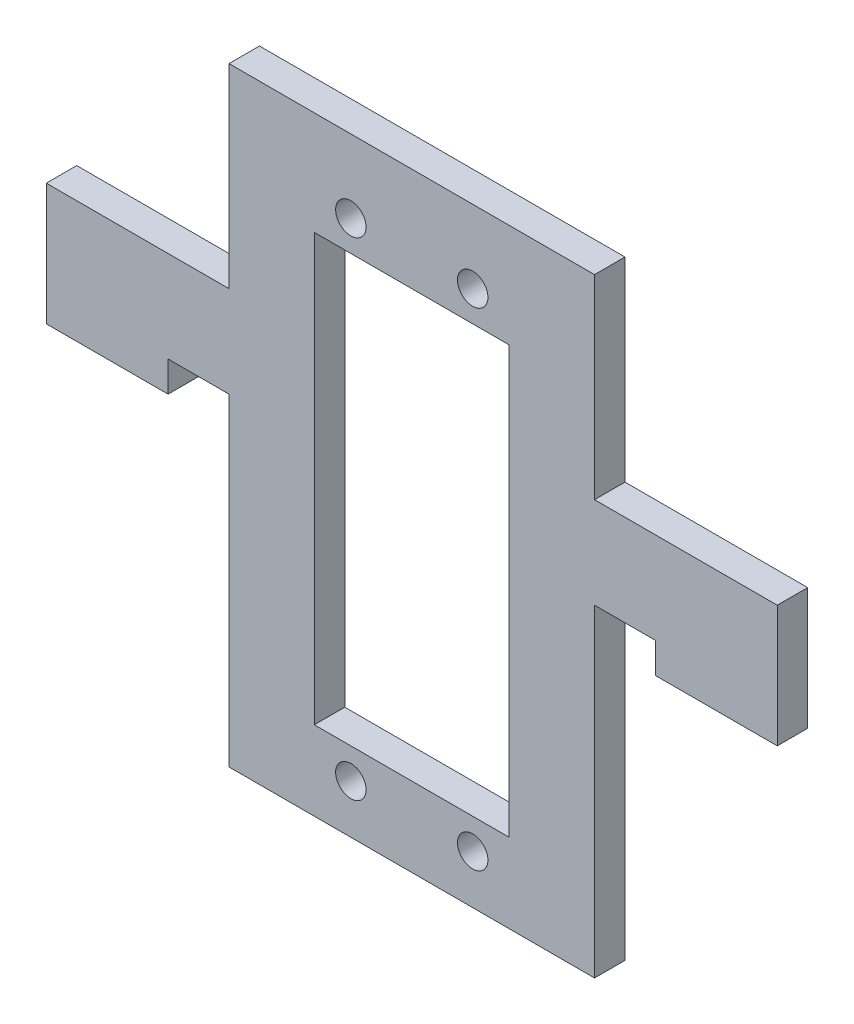
ISO-10303-21;
HEADER;
FILE_DESCRIPTION(('STEP AP214'),'2;1');
FILE_NAME('part.step','',(''),(''),'','','');
FILE_SCHEMA(('AUTOMOTIVE_DESIGN { 1 0 10303 214 1 1 1 1 }'));
ENDSEC;
DATA;
#1=APPLICATION_CONTEXT('core data for automotive mechanical design processes');
#2=APPLICATION_PROTOCOL_DEFINITION('international standard','automotive_design',2000,#1);
#3=PRODUCT_CONTEXT('',#1,'mechanical');
#4=PRODUCT('Part','Part','',(#3));
#5=PRODUCT_RELATED_PRODUCT_CATEGORY('part','',(#4));
#6=PRODUCT_DEFINITION_FORMATION('','',#4);
#7=PRODUCT_DEFINITION_CONTEXT('part definition',#1,'design');
#8=PRODUCT_DEFINITION('design','',#6,#7);
#9=PRODUCT_DEFINITION_SHAPE('','',#8);
#10=(LENGTH_UNIT() NAMED_UNIT(*) SI_UNIT(.MILLI.,.METRE.));
#11=(NAMED_UNIT(*) PLANE_ANGLE_UNIT() SI_UNIT($,.RADIAN.));
#12=(NAMED_UNIT(*) SI_UNIT($,.STERADIAN.) SOLID_ANGLE_UNIT());
#13=UNCERTAINTY_MEASURE_WITH_UNIT(LENGTH_MEASURE(1.E-05),#10,'distance_accuracy_value','');
#14=(GEOMETRIC_REPRESENTATION_CONTEXT(3) GLOBAL_UNCERTAINTY_ASSIGNED_CONTEXT((#13)) GLOBAL_UNIT_ASSIGNED_CONTEXT((#10,
#11,#12)) REPRESENTATION_CONTEXT('',''));
#15=CARTESIAN_POINT('',(0.,0.,0.));
#16=DIRECTION('',(0.,0.,1.));
#17=DIRECTION('',(1.,0.,0.));
#18=AXIS2_PLACEMENT_3D('',#15,#16,#17);
#19=CARTESIAN_POINT('',(0.,0.,3.175));
#20=DIRECTION('',(0.,0.,1.));
#21=DIRECTION('',(1.,0.,0.));
#22=AXIS2_PLACEMENT_3D('',#19,#20,#21);
#23=PLANE('',#22);
#24=CARTESIAN_POINT('',(16.51,-3.175,3.175));
#25=DIRECTION('',(0.,0.,1.));
#26=DIRECTION('',(-1.,0.,0.));
#27=AXIS2_PLACEMENT_3D('',#24,#25,#26);
#28=CIRCLE('',#27,1.5875);
#29=CARTESIAN_POINT('',(14.9225,-3.175,3.175));
#30=VERTEX_POINT('',#29);
#31=EDGE_CURVE('E629',#30,#30,#28,.T.);
#32=ORIENTED_EDGE('',*,*,#31,.F.);
#33=EDGE_LOOP('',(#32));
#34=FACE_BOUND('',#33,.T.);
#35=CARTESIAN_POINT('',(3.80999999999999,47.625,3.175));
#36=DIRECTION('',(0.,0.,1.));
#37=DIRECTION('',(1.,0.,0.));
#38=AXIS2_PLACEMENT_3D('',#35,#36,#37);
#39=CIRCLE('',#38,1.5875);
#40=CARTESIAN_POINT('',(5.39749999999999,47.625,3.175));
#41=VERTEX_POINT('',#40);
#42=EDGE_CURVE('E199',#41,#41,#39,.T.);
#43=ORIENTED_EDGE('',*,*,#42,.F.);
#44=EDGE_LOOP('',(#43));
#45=FACE_BOUND('',#44,.T.);
#46=DIRECTION('',(0.,-1.,0.));
#47=VECTOR('',#46,1.);
#48=CARTESIAN_POINT('',(-8.89000000000002,-8.25500000000001,3.175));
#49=LINE('',#48,#47);
#50=CARTESIAN_POINT('',(-8.89000000000001,25.4,3.175));
#51=VERTEX_POINT('',#50);
#52=CARTESIAN_POINT('',(-8.89000000000002,-8.25500000000001,3.175));
#53=VERTEX_POINT('',#52);
#54=EDGE_CURVE('E209',#51,#53,#49,.T.);
#55=ORIENTED_EDGE('',*,*,#54,.T.);
#56=DIRECTION('',(1.,0.,0.));
#57=VECTOR('',#56,1.);
#58=CARTESIAN_POINT('',(29.21,-8.25500000000001,3.175));
#59=LINE('',#58,#57);
#60=CARTESIAN_POINT('',(29.21,-8.25500000000001,3.175));
#61=VERTEX_POINT('',#60);
#62=EDGE_CURVE('E212',#53,#61,#59,.T.);
#63=ORIENTED_EDGE('',*,*,#62,.T.);
#64=DIRECTION('',(0.,1.,0.));
#65=VECTOR('',#64,1.);
#66=CARTESIAN_POINT('',(29.21,25.4,3.175));
#67=LINE('',#66,#65);
#68=CARTESIAN_POINT('',(29.21,25.4,3.175));
#69=VERTEX_POINT('',#68);
#70=EDGE_CURVE('E215',#61,#69,#67,.T.);
#71=ORIENTED_EDGE('',*,*,#70,.T.);
#72=DIRECTION('',(1.,0.,0.));
#73=VECTOR('',#72,1.);
#74=CARTESIAN_POINT('',(35.56,25.4,3.175));
#75=LINE('',#74,#73);
#76=CARTESIAN_POINT('',(35.56,25.4,3.175));
#77=VERTEX_POINT('',#76);
#78=EDGE_CURVE('E217',#69,#77,#75,.T.);
#79=ORIENTED_EDGE('',*,*,#78,.T.);
#80=DIRECTION('',(0.,-1.,0.));
#81=VECTOR('',#80,1.);
#82=CARTESIAN_POINT('',(35.56,22.225,3.175));
#83=LINE('',#82,#81);
#84=CARTESIAN_POINT('',(35.56,22.225,3.175));
#85=VERTEX_POINT('',#84);
#86=EDGE_CURVE('E219',#77,#85,#83,.T.);
#87=ORIENTED_EDGE('',*,*,#86,.T.);
#88=DIRECTION('',(1.,0.,0.));
#89=VECTOR('',#88,1.);
#90=CARTESIAN_POINT('',(48.26,22.225,3.175));
#91=LINE('',#90,#89);
#92=CARTESIAN_POINT('',(48.26,22.225,3.175));
#93=VERTEX_POINT('',#92);
#94=EDGE_CURVE('E221',#85,#93,#91,.T.);
#95=ORIENTED_EDGE('',*,*,#94,.T.);
#96=DIRECTION('',(0.,1.,0.));
#97=VECTOR('',#96,1.);
#98=CARTESIAN_POINT('',(48.26,34.925,3.175));
#99=LINE('',#98,#97);
#100=CARTESIAN_POINT('',(48.26,34.925,3.175));
#101=VERTEX_POINT('',#100);
#102=EDGE_CURVE('E223',#93,#101,#99,.T.);
#103=ORIENTED_EDGE('',*,*,#102,.T.);
#104=DIRECTION('',(-1.,0.,0.));
#105=VECTOR('',#104,1.);
#106=CARTESIAN_POINT('',(29.21,34.925,3.175));
#107=LINE('',#106,#105);
#108=CARTESIAN_POINT('',(29.21,34.925,3.175));
#109=VERTEX_POINT('',#108);
#110=EDGE_CURVE('E225',#101,#109,#107,.T.);
#111=ORIENTED_EDGE('',*,*,#110,.T.);
#112=DIRECTION('',(0.,1.,0.));
#113=VECTOR('',#112,1.);
#114=CARTESIAN_POINT('',(29.21,55.245,3.175));
#115=LINE('',#114,#113);
#116=CARTESIAN_POINT('',(29.21,55.245,3.175));
#117=VERTEX_POINT('',#116);
#118=EDGE_CURVE('E227',#109,#117,#115,.T.);
#119=ORIENTED_EDGE('',*,*,#118,.T.);
#120=DIRECTION('',(-1.,0.,0.));
#121=VECTOR('',#120,1.);
#122=CARTESIAN_POINT('',(-8.89000000000001,55.245,3.175));
#123=LINE('',#122,#121);
#124=CARTESIAN_POINT('',(-8.89000000000001,55.245,3.175));
#125=VERTEX_POINT('',#124);
#126=EDGE_CURVE('E229',#117,#125,#123,.T.);
#127=ORIENTED_EDGE('',*,*,#126,.T.);
#128=DIRECTION('',(0.,-1.,0.));
#129=VECTOR('',#128,1.);
#130=CARTESIAN_POINT('',(-8.89000000000001,34.925,3.175));
#131=LINE('',#130,#129);
#132=CARTESIAN_POINT('',(-8.89000000000001,34.925,3.175));
#133=VERTEX_POINT('',#132);
#134=EDGE_CURVE('E231',#125,#133,#131,.T.);
#135=ORIENTED_EDGE('',*,*,#134,.T.);
#136=DIRECTION('',(-1.,0.,0.));
#137=VECTOR('',#136,1.);
#138=CARTESIAN_POINT('',(-27.94,34.925,3.175));
#139=LINE('',#138,#137);
#140=CARTESIAN_POINT('',(-27.94,34.925,3.175));
#141=VERTEX_POINT('',#140);
#142=EDGE_CURVE('E233',#133,#141,#139,.T.);
#143=ORIENTED_EDGE('',*,*,#142,.T.);
#144=DIRECTION('',(0.,-1.,0.));
#145=VECTOR('',#144,1.);
#146=CARTESIAN_POINT('',(-27.94,22.225,3.175));
#147=LINE('',#146,#145);
#148=CARTESIAN_POINT('',(-27.94,22.225,3.175));
#149=VERTEX_POINT('',#148);
#150=EDGE_CURVE('E235',#141,#149,#147,.T.);
#151=ORIENTED_EDGE('',*,*,#150,.T.);
#152=DIRECTION('',(1.,0.,0.));
#153=VECTOR('',#152,1.);
#154=CARTESIAN_POINT('',(-15.24,22.225,3.175));
#155=LINE('',#154,#153);
#156=CARTESIAN_POINT('',(-15.24,22.225,3.175));
#157=VERTEX_POINT('',#156);
#158=EDGE_CURVE('E237',#149,#157,#155,.T.);
#159=ORIENTED_EDGE('',*,*,#158,.T.);
#160=DIRECTION('',(0.,1.,0.));
#161=VECTOR('',#160,1.);
#162=CARTESIAN_POINT('',(-15.24,25.4,3.175));
#163=LINE('',#162,#161);
#164=CARTESIAN_POINT('',(-15.24,25.4,3.175));
#165=VERTEX_POINT('',#164);
#166=EDGE_CURVE('E239',#157,#165,#163,.T.);
#167=ORIENTED_EDGE('',*,*,#166,.T.);
#168=DIRECTION('',(1.,0.,0.));
#169=VECTOR('',#168,1.);
#170=CARTESIAN_POINT('',(-8.89000000000001,25.4,3.175));
#171=LINE('',#170,#169);
#172=EDGE_CURVE('E241',#165,#51,#171,.T.);
#173=ORIENTED_EDGE('',*,*,#172,.T.);
#174=EDGE_LOOP('',(#55,#63,#71,#79,#87,#95,#103,#111,#119,#127,#135,#143,#151,#159,#167,#173));
#175=FACE_BOUND('',#174,.T.);
#176=DIRECTION('',(1.,0.,0.));
#177=VECTOR('',#176,1.);
#178=CARTESIAN_POINT('',(0.,0.,3.175));
#179=LINE('',#178,#177);
#180=CARTESIAN_POINT('',(0.,0.,3.175));
#181=VERTEX_POINT('',#180);
#182=CARTESIAN_POINT('',(20.32,0.,3.175));
#183=VERTEX_POINT('',#182);
#184=EDGE_CURVE('E178',#181,#183,#179,.T.);
#185=ORIENTED_EDGE('',*,*,#184,.F.);
#186=DIRECTION('',(0.,-1.,0.));
#187=VECTOR('',#186,1.);
#188=CARTESIAN_POINT('',(0.,0.,3.175));
#189=LINE('',#188,#187);
#190=CARTESIAN_POINT('',(0.,44.45,3.175));
#191=VERTEX_POINT('',#190);
#192=EDGE_CURVE('E170',#191,#181,#189,.T.);
#193=ORIENTED_EDGE('',*,*,#192,.F.);
#194=DIRECTION('',(-1.,0.,0.));
#195=VECTOR('',#194,1.);
#196=CARTESIAN_POINT('',(0.,44.45,3.175));
#197=LINE('',#196,#195);
#198=CARTESIAN_POINT('',(20.32,44.45,3.175));
#199=VERTEX_POINT('',#198);
#200=EDGE_CURVE('E193',#199,#191,#197,.T.);
#201=ORIENTED_EDGE('',*,*,#200,.F.);
#202=DIRECTION('',(0.,1.,0.));
#203=VECTOR('',#202,1.);
#204=CARTESIAN_POINT('',(20.32,0.,3.175));
#205=LINE('',#204,#203);
#206=EDGE_CURVE('E191',#183,#199,#205,.T.);
#207=ORIENTED_EDGE('',*,*,#206,.F.);
#208=EDGE_LOOP('',(#185,#193,#201,#207));
#209=FACE_BOUND('',#208,.T.);
#210=CARTESIAN_POINT('',(16.51,47.625,3.175));
#211=DIRECTION('',(0.,0.,1.));
#212=DIRECTION('',(1.,0.,0.));
#213=AXIS2_PLACEMENT_3D('',#210,#211,#212);
#214=CIRCLE('',#213,1.5875);
#215=CARTESIAN_POINT('',(18.0975,47.625,3.175));
#216=VERTEX_POINT('',#215);
#217=EDGE_CURVE('E635',#216,#216,#214,.T.);
#218=ORIENTED_EDGE('',*,*,#217,.F.);
#219=EDGE_LOOP('',(#218));
#220=FACE_BOUND('',#219,.T.);
#221=CARTESIAN_POINT('',(3.80999999999999,-3.175,3.175));
#222=DIRECTION('',(0.,0.,1.));
#223=DIRECTION('',(-1.,0.,0.));
#224=AXIS2_PLACEMENT_3D('',#221,#222,#223);
#225=CIRCLE('',#224,1.5875);
#226=CARTESIAN_POINT('',(2.22249999999999,-3.175,3.175));
#227=VERTEX_POINT('',#226);
#228=EDGE_CURVE('E620',#227,#227,#225,.T.);
#229=ORIENTED_EDGE('',*,*,#228,.F.);
#230=EDGE_LOOP('',(#229));
#231=FACE_BOUND('',#230,.T.);
#232=ADVANCED_FACE('F33',(#34,#45,#175,#209,#220,#231),#23,.T.);
#233=CARTESIAN_POINT('',(0.,0.,0.));
#234=DIRECTION('',(0.,0.,1.));
#235=DIRECTION('',(1.,0.,0.));
#236=AXIS2_PLACEMENT_3D('',#233,#234,#235);
#237=PLANE('',#236);
#238=DIRECTION('',(0.,-1.,0.));
#239=VECTOR('',#238,1.);
#240=CARTESIAN_POINT('',(-8.89000000000002,-8.25500000000001,0.));
#241=LINE('',#240,#239);
#242=CARTESIAN_POINT('',(-8.89000000000001,25.4,0.));
#243=VERTEX_POINT('',#242);
#244=CARTESIAN_POINT('',(-8.89000000000002,-8.25500000000001,0.));
#245=VERTEX_POINT('',#244);
#246=EDGE_CURVE('E186',#243,#245,#241,.T.);
#247=ORIENTED_EDGE('',*,*,#246,.F.);
#248=DIRECTION('',(1.,0.,0.));
#249=VECTOR('',#248,1.);
#250=CARTESIAN_POINT('',(-8.89000000000001,25.4,0.));
#251=LINE('',#250,#249);
#252=CARTESIAN_POINT('',(-15.24,25.4,0.));
#253=VERTEX_POINT('',#252);
#254=EDGE_CURVE('E213',#253,#243,#251,.T.);
#255=ORIENTED_EDGE('',*,*,#254,.F.);
#256=DIRECTION('',(0.,1.,0.));
#257=VECTOR('',#256,1.);
#258=CARTESIAN_POINT('',(-15.24,25.4,0.));
#259=LINE('',#258,#257);
#260=CARTESIAN_POINT('',(-15.24,22.225,0.));
#261=VERTEX_POINT('',#260);
#262=EDGE_CURVE('E272',#261,#253,#259,.T.);
#263=ORIENTED_EDGE('',*,*,#262,.F.);
#264=DIRECTION('',(1.,0.,0.));
#265=VECTOR('',#264,1.);
#266=CARTESIAN_POINT('',(-15.24,22.225,0.));
#267=LINE('',#266,#265);
#268=CARTESIAN_POINT('',(-27.94,22.225,0.));
#269=VERTEX_POINT('',#268);
#270=EDGE_CURVE('E270',#269,#261,#267,.T.);
#271=ORIENTED_EDGE('',*,*,#270,.F.);
#272=DIRECTION('',(0.,-1.,0.));
#273=VECTOR('',#272,1.);
#274=CARTESIAN_POINT('',(-27.94,22.225,0.));
#275=LINE('',#274,#273);
#276=CARTESIAN_POINT('',(-27.94,34.925,0.));
#277=VERTEX_POINT('',#276);
#278=EDGE_CURVE('E268',#277,#269,#275,.T.);
#279=ORIENTED_EDGE('',*,*,#278,.F.);
#280=DIRECTION('',(-1.,0.,0.));
#281=VECTOR('',#280,1.);
#282=CARTESIAN_POINT('',(-27.94,34.925,0.));
#283=LINE('',#282,#281);
#284=CARTESIAN_POINT('',(-8.89000000000001,34.925,0.));
#285=VERTEX_POINT('',#284);
#286=EDGE_CURVE('E266',#285,#277,#283,.T.);
#287=ORIENTED_EDGE('',*,*,#286,.F.);
#288=DIRECTION('',(0.,-1.,0.));
#289=VECTOR('',#288,1.);
#290=CARTESIAN_POINT('',(-8.89000000000001,34.925,0.));
#291=LINE('',#290,#289);
#292=CARTESIAN_POINT('',(-8.89000000000001,55.245,0.));
#293=VERTEX_POINT('',#292);
#294=EDGE_CURVE('E264',#293,#285,#291,.T.);
#295=ORIENTED_EDGE('',*,*,#294,.F.);
#296=DIRECTION('',(-1.,0.,0.));
#297=VECTOR('',#296,1.);
#298=CARTESIAN_POINT('',(-8.89000000000001,55.245,0.));
#299=LINE('',#298,#297);
#300=CARTESIAN_POINT('',(29.21,55.245,0.));
#301=VERTEX_POINT('',#300);
#302=EDGE_CURVE('E262',#301,#293,#299,.T.);
#303=ORIENTED_EDGE('',*,*,#302,.F.);
#304=DIRECTION('',(0.,1.,0.));
#305=VECTOR('',#304,1.);
#306=CARTESIAN_POINT('',(29.21,55.245,0.));
#307=LINE('',#306,#305);
#308=CARTESIAN_POINT('',(29.21,34.925,0.));
#309=VERTEX_POINT('',#308);
#310=EDGE_CURVE('E260',#309,#301,#307,.T.);
#311=ORIENTED_EDGE('',*,*,#310,.F.);
#312=DIRECTION('',(-1.,0.,0.));
#313=VECTOR('',#312,1.);
#314=CARTESIAN_POINT('',(29.21,34.925,0.));
#315=LINE('',#314,#313);
#316=CARTESIAN_POINT('',(48.26,34.925,0.));
#317=VERTEX_POINT('',#316);
#318=EDGE_CURVE('E258',#317,#309,#315,.T.);
#319=ORIENTED_EDGE('',*,*,#318,.F.);
#320=DIRECTION('',(0.,1.,0.));
#321=VECTOR('',#320,1.);
#322=CARTESIAN_POINT('',(48.26,34.925,0.));
#323=LINE('',#322,#321);
#324=CARTESIAN_POINT('',(48.26,22.225,0.));
#325=VERTEX_POINT('',#324);
#326=EDGE_CURVE('E256',#325,#317,#323,.T.);
#327=ORIENTED_EDGE('',*,*,#326,.F.);
#328=DIRECTION('',(1.,0.,0.));
#329=VECTOR('',#328,1.);
#330=CARTESIAN_POINT('',(48.26,22.225,0.));
#331=LINE('',#330,#329);
#332=CARTESIAN_POINT('',(35.56,22.225,0.));
#333=VERTEX_POINT('',#332);
#334=EDGE_CURVE('E254',#333,#325,#331,.T.);
#335=ORIENTED_EDGE('',*,*,#334,.F.);
#336=DIRECTION('',(0.,-1.,0.));
#337=VECTOR('',#336,1.);
#338=CARTESIAN_POINT('',(35.56,22.225,0.));
#339=LINE('',#338,#337);
#340=CARTESIAN_POINT('',(35.56,25.4,0.));
#341=VERTEX_POINT('',#340);
#342=EDGE_CURVE('E252',#341,#333,#339,.T.);
#343=ORIENTED_EDGE('',*,*,#342,.F.);
#344=DIRECTION('',(1.,0.,0.));
#345=VECTOR('',#344,1.);
#346=CARTESIAN_POINT('',(35.56,25.4,0.));
#347=LINE('',#346,#345);
#348=CARTESIAN_POINT('',(29.21,25.4,0.));
#349=VERTEX_POINT('',#348);
#350=EDGE_CURVE('E250',#349,#341,#347,.T.);
#351=ORIENTED_EDGE('',*,*,#350,.F.);
#352=DIRECTION('',(0.,1.,0.));
#353=VECTOR('',#352,1.);
#354=CARTESIAN_POINT('',(29.21,25.4,0.));
#355=LINE('',#354,#353);
#356=CARTESIAN_POINT('',(29.21,-8.25500000000001,0.));
#357=VERTEX_POINT('',#356);
#358=EDGE_CURVE('E248',#357,#349,#355,.T.);
#359=ORIENTED_EDGE('',*,*,#358,.F.);
#360=DIRECTION('',(1.,0.,0.));
#361=VECTOR('',#360,1.);
#362=CARTESIAN_POINT('',(29.21,-8.25500000000001,0.));
#363=LINE('',#362,#361);
#364=EDGE_CURVE('E246',#245,#357,#363,.T.);
#365=ORIENTED_EDGE('',*,*,#364,.F.);
#366=EDGE_LOOP('',(#247,#255,#263,#271,#279,#287,#295,#303,#311,#319,#327,#335,#343,#351,#359,#365));
#367=FACE_BOUND('',#366,.T.);
#368=DIRECTION('',(0.,-1.,0.));
#369=VECTOR('',#368,1.);
#370=CARTESIAN_POINT('',(0.,0.,0.));
#371=LINE('',#370,#369);
#372=CARTESIAN_POINT('',(0.,44.45,0.));
#373=VERTEX_POINT('',#372);
#374=CARTESIAN_POINT('',(0.,0.,0.));
#375=VERTEX_POINT('',#374);
#376=EDGE_CURVE('E56',#373,#375,#371,.T.);
#377=ORIENTED_EDGE('',*,*,#376,.T.);
#378=DIRECTION('',(1.,0.,0.));
#379=VECTOR('',#378,1.);
#380=CARTESIAN_POINT('',(0.,0.,0.));
#381=LINE('',#380,#379);
#382=CARTESIAN_POINT('',(20.32,0.,0.));
#383=VERTEX_POINT('',#382);
#384=EDGE_CURVE('E185',#375,#383,#381,.T.);
#385=ORIENTED_EDGE('',*,*,#384,.T.);
#386=DIRECTION('',(0.,1.,0.));
#387=VECTOR('',#386,1.);
#388=CARTESIAN_POINT('',(20.32,0.,0.));
#389=LINE('',#388,#387);
#390=CARTESIAN_POINT('',(20.32,44.45,0.));
#391=VERTEX_POINT('',#390);
#392=EDGE_CURVE('E201',#383,#391,#389,.T.);
#393=ORIENTED_EDGE('',*,*,#392,.T.);
#394=DIRECTION('',(-1.,0.,0.));
#395=VECTOR('',#394,1.);
#396=CARTESIAN_POINT('',(0.,44.45,0.));
#397=LINE('',#396,#395);
#398=EDGE_CURVE('E179',#391,#373,#397,.T.);
#399=ORIENTED_EDGE('',*,*,#398,.T.);
#400=EDGE_LOOP('',(#377,#385,#393,#399));
#401=FACE_BOUND('',#400,.T.);
#402=CARTESIAN_POINT('',(3.80999999999999,47.625,0.));
#403=DIRECTION('',(0.,0.,1.));
#404=DIRECTION('',(1.,0.,0.));
#405=AXIS2_PLACEMENT_3D('',#402,#403,#404);
#406=CIRCLE('',#405,1.5875);
#407=CARTESIAN_POINT('',(5.39749999999999,47.625,0.));
#408=VERTEX_POINT('',#407);
#409=EDGE_CURVE('E638',#408,#408,#406,.T.);
#410=ORIENTED_EDGE('',*,*,#409,.T.);
#411=EDGE_LOOP('',(#410));
#412=FACE_BOUND('',#411,.T.);
#413=CARTESIAN_POINT('',(16.51,47.625,0.));
#414=DIRECTION('',(0.,0.,1.));
#415=DIRECTION('',(1.,0.,0.));
#416=AXIS2_PLACEMENT_3D('',#413,#414,#415);
#417=CIRCLE('',#416,1.5875);
#418=CARTESIAN_POINT('',(18.0975,47.625,0.));
#419=VERTEX_POINT('',#418);
#420=EDGE_CURVE('E632',#419,#419,#417,.T.);
#421=ORIENTED_EDGE('',*,*,#420,.T.);
#422=EDGE_LOOP('',(#421));
#423=FACE_BOUND('',#422,.T.);
#424=CARTESIAN_POINT('',(16.51,-3.175,0.));
#425=DIRECTION('',(0.,0.,1.));
#426=DIRECTION('',(-1.,0.,0.));
#427=AXIS2_PLACEMENT_3D('',#424,#425,#426);
#428=CIRCLE('',#427,1.5875);
#429=CARTESIAN_POINT('',(14.9225,-3.175,0.));
#430=VERTEX_POINT('',#429);
#431=EDGE_CURVE('E626',#430,#430,#428,.T.);
#432=ORIENTED_EDGE('',*,*,#431,.T.);
#433=EDGE_LOOP('',(#432));
#434=FACE_BOUND('',#433,.T.);
#435=CARTESIAN_POINT('',(3.80999999999999,-3.175,0.));
#436=DIRECTION('',(0.,0.,1.));
#437=DIRECTION('',(-1.,0.,0.));
#438=AXIS2_PLACEMENT_3D('',#435,#436,#437);
#439=CIRCLE('',#438,1.5875);
#440=CARTESIAN_POINT('',(2.22249999999999,-3.175,0.));
#441=VERTEX_POINT('',#440);
#442=EDGE_CURVE('E623',#441,#441,#439,.T.);
#443=ORIENTED_EDGE('',*,*,#442,.T.);
#444=EDGE_LOOP('',(#443));
#445=FACE_BOUND('',#444,.T.);
#446=ADVANCED_FACE('F326',(#367,#401,#412,#423,#434,#445),#237,.F.);
#447=CARTESIAN_POINT('',(-8.89000000000002,-8.25500000000001,3.175));
#448=DIRECTION('',(1.,0.,0.));
#449=DIRECTION('',(0.,1.,0.));
#450=AXIS2_PLACEMENT_3D('',#447,#448,#449);
#451=PLANE('',#450);
#452=ORIENTED_EDGE('',*,*,#246,.T.);
#453=DIRECTION('',(0.,0.,-1.));
#454=VECTOR('',#453,1.);
#455=CARTESIAN_POINT('',(-8.89000000000002,-8.25500000000001,3.175));
#456=LINE('',#455,#454);
#457=EDGE_CURVE('E11',#53,#245,#456,.T.);
#458=ORIENTED_EDGE('',*,*,#457,.F.);
#459=ORIENTED_EDGE('',*,*,#54,.F.);
#460=DIRECTION('',(0.,0.,-1.));
#461=VECTOR('',#460,1.);
#462=CARTESIAN_POINT('',(-8.89000000000001,25.4,3.175));
#463=LINE('',#462,#461);
#464=EDGE_CURVE('E243',#51,#243,#463,.T.);
#465=ORIENTED_EDGE('',*,*,#464,.T.);
#466=EDGE_LOOP('',(#452,#458,#459,#465));
#467=FACE_BOUND('',#466,.T.);
#468=ADVANCED_FACE('F35',(#467),#451,.F.);
#469=CARTESIAN_POINT('',(29.21,-8.25500000000001,3.175));
#470=DIRECTION('',(0.,1.,0.));
#471=DIRECTION('',(0.,0.,1.));
#472=AXIS2_PLACEMENT_3D('',#469,#470,#471);
#473=PLANE('',#472);
#474=ORIENTED_EDGE('',*,*,#364,.T.);
#475=DIRECTION('',(0.,0.,-1.));
#476=VECTOR('',#475,1.);
#477=CARTESIAN_POINT('',(29.21,-8.25500000000001,3.175));
#478=LINE('',#477,#476);
#479=EDGE_CURVE('E41',#61,#357,#478,.T.);
#480=ORIENTED_EDGE('',*,*,#479,.F.);
#481=ORIENTED_EDGE('',*,*,#62,.F.);
#482=ORIENTED_EDGE('',*,*,#457,.T.);
#483=EDGE_LOOP('',(#474,#480,#481,#482));
#484=FACE_BOUND('',#483,.T.);
#485=ADVANCED_FACE('F343',(#484),#473,.F.);
#486=CARTESIAN_POINT('',(29.21,25.4,3.175));
#487=DIRECTION('',(-1.,0.,0.));
#488=DIRECTION('',(0.,-1.,0.));
#489=AXIS2_PLACEMENT_3D('',#486,#487,#488);
#490=PLANE('',#489);
#491=ORIENTED_EDGE('',*,*,#358,.T.);
#492=DIRECTION('',(0.,0.,-1.));
#493=VECTOR('',#492,1.);
#494=CARTESIAN_POINT('',(29.21,25.4,3.175));
#495=LINE('',#494,#493);
#496=EDGE_CURVE('E313',#69,#349,#495,.T.);
#497=ORIENTED_EDGE('',*,*,#496,.F.);
#498=ORIENTED_EDGE('',*,*,#70,.F.);
#499=ORIENTED_EDGE('',*,*,#479,.T.);
#500=EDGE_LOOP('',(#491,#497,#498,#499));
#501=FACE_BOUND('',#500,.T.);
#502=ADVANCED_FACE('F320',(#501),#490,.F.);
#503=CARTESIAN_POINT('',(35.56,25.4,3.175));
#504=DIRECTION('',(0.,1.,0.));
#505=DIRECTION('',(0.,0.,1.));
#506=AXIS2_PLACEMENT_3D('',#503,#504,#505);
#507=PLANE('',#506);
#508=ORIENTED_EDGE('',*,*,#350,.T.);
#509=DIRECTION('',(0.,0.,-1.));
#510=VECTOR('',#509,1.);
#511=CARTESIAN_POINT('',(35.56,25.4,3.175));
#512=LINE('',#511,#510);
#513=EDGE_CURVE('E310',#77,#341,#512,.T.);
#514=ORIENTED_EDGE('',*,*,#513,.F.);
#515=ORIENTED_EDGE('',*,*,#78,.F.);
#516=ORIENTED_EDGE('',*,*,#496,.T.);
#517=EDGE_LOOP('',(#508,#514,#515,#516));
#518=FACE_BOUND('',#517,.T.);
#519=ADVANCED_FACE('F332',(#518),#507,.F.);
#520=CARTESIAN_POINT('',(35.56,22.225,3.175));
#521=DIRECTION('',(1.,0.,0.));
#522=DIRECTION('',(0.,1.,0.));
#523=AXIS2_PLACEMENT_3D('',#520,#521,#522);
#524=PLANE('',#523);
#525=ORIENTED_EDGE('',*,*,#342,.T.);
#526=DIRECTION('',(0.,0.,-1.));
#527=VECTOR('',#526,1.);
#528=CARTESIAN_POINT('',(35.56,22.225,3.175));
#529=LINE('',#528,#527);
#530=EDGE_CURVE('E307',#85,#333,#529,.T.);
#531=ORIENTED_EDGE('',*,*,#530,.F.);
#532=ORIENTED_EDGE('',*,*,#86,.F.);
#533=ORIENTED_EDGE('',*,*,#513,.T.);
#534=EDGE_LOOP('',(#525,#531,#532,#533));
#535=FACE_BOUND('',#534,.T.);
#536=ADVANCED_FACE('F336',(#535),#524,.F.);
#537=CARTESIAN_POINT('',(48.26,22.225,3.175));
#538=DIRECTION('',(0.,1.,0.));
#539=DIRECTION('',(0.,0.,1.));
#540=AXIS2_PLACEMENT_3D('',#537,#538,#539);
#541=PLANE('',#540);
#542=ORIENTED_EDGE('',*,*,#334,.T.);
#543=DIRECTION('',(0.,0.,-1.));
#544=VECTOR('',#543,1.);
#545=CARTESIAN_POINT('',(48.26,22.225,3.175));
#546=LINE('',#545,#544);
#547=EDGE_CURVE('E304',#93,#325,#546,.T.);
#548=ORIENTED_EDGE('',*,*,#547,.F.);
#549=ORIENTED_EDGE('',*,*,#94,.F.);
#550=ORIENTED_EDGE('',*,*,#530,.T.);
#551=EDGE_LOOP('',(#542,#548,#549,#550));
#552=FACE_BOUND('',#551,.T.);
#553=ADVANCED_FACE('F396',(#552),#541,.F.);
#554=CARTESIAN_POINT('',(48.26,34.925,3.175));
#555=DIRECTION('',(-1.,0.,0.));
#556=DIRECTION('',(0.,0.,1.));
#557=AXIS2_PLACEMENT_3D('',#554,#555,#556);
#558=PLANE('',#557);
#559=ORIENTED_EDGE('',*,*,#326,.T.);
#560=DIRECTION('',(0.,0.,-1.));
#561=VECTOR('',#560,1.);
#562=CARTESIAN_POINT('',(48.26,34.925,3.175));
#563=LINE('',#562,#561);
#564=EDGE_CURVE('E301',#101,#317,#563,.T.);
#565=ORIENTED_EDGE('',*,*,#564,.F.);
#566=ORIENTED_EDGE('',*,*,#102,.F.);
#567=ORIENTED_EDGE('',*,*,#547,.T.);
#568=EDGE_LOOP('',(#559,#565,#566,#567));
#569=FACE_BOUND('',#568,.T.);
#570=ADVANCED_FACE('F393',(#569),#558,.F.);
#571=CARTESIAN_POINT('',(29.21,34.925,3.175));
#572=DIRECTION('',(0.,-1.,0.));
#573=DIRECTION('',(0.,0.,-1.));
#574=AXIS2_PLACEMENT_3D('',#571,#572,#573);
#575=PLANE('',#574);
#576=ORIENTED_EDGE('',*,*,#318,.T.);
#577=DIRECTION('',(0.,0.,-1.));
#578=VECTOR('',#577,1.);
#579=CARTESIAN_POINT('',(29.21,34.925,3.175));
#580=LINE('',#579,#578);
#581=EDGE_CURVE('E298',#109,#309,#580,.T.);
#582=ORIENTED_EDGE('',*,*,#581,.F.);
#583=ORIENTED_EDGE('',*,*,#110,.F.);
#584=ORIENTED_EDGE('',*,*,#564,.T.);
#585=EDGE_LOOP('',(#576,#582,#583,#584));
#586=FACE_BOUND('',#585,.T.);
#587=ADVANCED_FACE('F389',(#586),#575,.F.);
#588=CARTESIAN_POINT('',(29.21,55.245,3.175));
#589=DIRECTION('',(-1.,0.,0.));
#590=DIRECTION('',(0.,0.,1.));
#591=AXIS2_PLACEMENT_3D('',#588,#589,#590);
#592=PLANE('',#591);
#593=ORIENTED_EDGE('',*,*,#310,.T.);
#594=DIRECTION('',(0.,0.,-1.));
#595=VECTOR('',#594,1.);
#596=CARTESIAN_POINT('',(29.21,55.245,3.175));
#597=LINE('',#596,#595);
#598=EDGE_CURVE('E295',#117,#301,#597,.T.);
#599=ORIENTED_EDGE('',*,*,#598,.F.);
#600=ORIENTED_EDGE('',*,*,#118,.F.);
#601=ORIENTED_EDGE('',*,*,#581,.T.);
#602=EDGE_LOOP('',(#593,#599,#600,#601));
#603=FACE_BOUND('',#602,.T.);
#604=ADVANCED_FACE('F385',(#603),#592,.F.);
#605=CARTESIAN_POINT('',(-8.89000000000001,55.245,3.175));
#606=DIRECTION('',(0.,-1.,0.));
#607=DIRECTION('',(0.,0.,-1.));
#608=AXIS2_PLACEMENT_3D('',#605,#606,#607);
#609=PLANE('',#608);
#610=ORIENTED_EDGE('',*,*,#302,.T.);
#611=DIRECTION('',(0.,0.,-1.));
#612=VECTOR('',#611,1.);
#613=CARTESIAN_POINT('',(-8.89000000000001,55.245,3.175));
#614=LINE('',#613,#612);
#615=EDGE_CURVE('E292',#125,#293,#614,.T.);
#616=ORIENTED_EDGE('',*,*,#615,.F.);
#617=ORIENTED_EDGE('',*,*,#126,.F.);
#618=ORIENTED_EDGE('',*,*,#598,.T.);
#619=EDGE_LOOP('',(#610,#616,#617,#618));
#620=FACE_BOUND('',#619,.T.);
#621=ADVANCED_FACE('F380',(#620),#609,.F.);
#622=CARTESIAN_POINT('',(-8.89000000000001,34.925,3.175));
#623=DIRECTION('',(1.,0.,0.));
#624=DIRECTION('',(0.,0.,-1.));
#625=AXIS2_PLACEMENT_3D('',#622,#623,#624);
#626=PLANE('',#625);
#627=ORIENTED_EDGE('',*,*,#294,.T.);
#628=DIRECTION('',(0.,0.,-1.));
#629=VECTOR('',#628,1.);
#630=CARTESIAN_POINT('',(-8.89000000000001,34.925,3.175));
#631=LINE('',#630,#629);
#632=EDGE_CURVE('E289',#133,#285,#631,.T.);
#633=ORIENTED_EDGE('',*,*,#632,.F.);
#634=ORIENTED_EDGE('',*,*,#134,.F.);
#635=ORIENTED_EDGE('',*,*,#615,.T.);
#636=EDGE_LOOP('',(#627,#633,#634,#635));
#637=FACE_BOUND('',#636,.T.);
#638=ADVANCED_FACE('F374',(#637),#626,.F.);
#639=CARTESIAN_POINT('',(-27.94,34.925,3.175));
#640=DIRECTION('',(0.,-1.,0.));
#641=DIRECTION('',(0.,0.,-1.));
#642=AXIS2_PLACEMENT_3D('',#639,#640,#641);
#643=PLANE('',#642);
#644=ORIENTED_EDGE('',*,*,#286,.T.);
#645=DIRECTION('',(0.,0.,-1.));
#646=VECTOR('',#645,1.);
#647=CARTESIAN_POINT('',(-27.94,34.925,3.175));
#648=LINE('',#647,#646);
#649=EDGE_CURVE('E286',#141,#277,#648,.T.);
#650=ORIENTED_EDGE('',*,*,#649,.F.);
#651=ORIENTED_EDGE('',*,*,#142,.F.);
#652=ORIENTED_EDGE('',*,*,#632,.T.);
#653=EDGE_LOOP('',(#644,#650,#651,#652));
#654=FACE_BOUND('',#653,.T.);
#655=ADVANCED_FACE('F370',(#654),#643,.F.);
#656=CARTESIAN_POINT('',(-27.94,22.225,3.175));
#657=DIRECTION('',(1.,0.,0.));
#658=DIRECTION('',(0.,0.,-1.));
#659=AXIS2_PLACEMENT_3D('',#656,#657,#658);
#660=PLANE('',#659);
#661=ORIENTED_EDGE('',*,*,#278,.T.);
#662=DIRECTION('',(0.,0.,-1.));
#663=VECTOR('',#662,1.);
#664=CARTESIAN_POINT('',(-27.94,22.225,3.175));
#665=LINE('',#664,#663);
#666=EDGE_CURVE('E283',#149,#269,#665,.T.);
#667=ORIENTED_EDGE('',*,*,#666,.F.);
#668=ORIENTED_EDGE('',*,*,#150,.F.);
#669=ORIENTED_EDGE('',*,*,#649,.T.);
#670=EDGE_LOOP('',(#661,#667,#668,#669));
#671=FACE_BOUND('',#670,.T.);
#672=ADVANCED_FACE('F365',(#671),#660,.F.);
#673=CARTESIAN_POINT('',(-15.24,22.225,3.175));
#674=DIRECTION('',(0.,1.,0.));
#675=DIRECTION('',(-1.,0.,0.));
#676=AXIS2_PLACEMENT_3D('',#673,#674,#675);
#677=PLANE('',#676);
#678=ORIENTED_EDGE('',*,*,#270,.T.);
#679=DIRECTION('',(0.,0.,-1.));
#680=VECTOR('',#679,1.);
#681=CARTESIAN_POINT('',(-15.24,22.225,3.175));
#682=LINE('',#681,#680);
#683=EDGE_CURVE('E280',#157,#261,#682,.T.);
#684=ORIENTED_EDGE('',*,*,#683,.F.);
#685=ORIENTED_EDGE('',*,*,#158,.F.);
#686=ORIENTED_EDGE('',*,*,#666,.T.);
#687=EDGE_LOOP('',(#678,#684,#685,#686));
#688=FACE_BOUND('',#687,.T.);
#689=ADVANCED_FACE('F359',(#688),#677,.F.);
#690=CARTESIAN_POINT('',(-15.24,25.4,3.175));
#691=DIRECTION('',(-1.,0.,0.));
#692=DIRECTION('',(0.,-1.,0.));
#693=AXIS2_PLACEMENT_3D('',#690,#691,#692);
#694=PLANE('',#693);
#695=ORIENTED_EDGE('',*,*,#262,.T.);
#696=DIRECTION('',(0.,0.,-1.));
#697=VECTOR('',#696,1.);
#698=CARTESIAN_POINT('',(-15.24,25.4,3.175));
#699=LINE('',#698,#697);
#700=EDGE_CURVE('E277',#165,#253,#699,.T.);
#701=ORIENTED_EDGE('',*,*,#700,.F.);
#702=ORIENTED_EDGE('',*,*,#166,.F.);
#703=ORIENTED_EDGE('',*,*,#683,.T.);
#704=EDGE_LOOP('',(#695,#701,#702,#703));
#705=FACE_BOUND('',#704,.T.);
#706=ADVANCED_FACE('F355',(#705),#694,.F.);
#707=CARTESIAN_POINT('',(-8.89000000000001,25.4,3.175));
#708=DIRECTION('',(0.,1.,0.));
#709=DIRECTION('',(0.,0.,1.));
#710=AXIS2_PLACEMENT_3D('',#707,#708,#709);
#711=PLANE('',#710);
#712=ORIENTED_EDGE('',*,*,#254,.T.);
#713=ORIENTED_EDGE('',*,*,#464,.F.);
#714=ORIENTED_EDGE('',*,*,#172,.F.);
#715=ORIENTED_EDGE('',*,*,#700,.T.);
#716=EDGE_LOOP('',(#712,#713,#714,#715));
#717=FACE_BOUND('',#716,.T.);
#718=ADVANCED_FACE('F350',(#717),#711,.F.);
#719=CARTESIAN_POINT('',(0.,0.,3.175));
#720=DIRECTION('',(1.,0.,0.));
#721=DIRECTION('',(0.,1.,0.));
#722=AXIS2_PLACEMENT_3D('',#719,#720,#721);
#723=PLANE('',#722);
#724=ORIENTED_EDGE('',*,*,#376,.F.);
#725=DIRECTION('',(0.,0.,-1.));
#726=VECTOR('',#725,1.);
#727=CARTESIAN_POINT('',(0.,44.45,3.175));
#728=LINE('',#727,#726);
#729=EDGE_CURVE('E174',#191,#373,#728,.T.);
#730=ORIENTED_EDGE('',*,*,#729,.F.);
#731=ORIENTED_EDGE('',*,*,#192,.T.);
#732=DIRECTION('',(0.,0.,-1.));
#733=VECTOR('',#732,1.);
#734=CARTESIAN_POINT('',(0.,0.,3.175));
#735=LINE('',#734,#733);
#736=EDGE_CURVE('E173',#181,#375,#735,.T.);
#737=ORIENTED_EDGE('',*,*,#736,.T.);
#738=EDGE_LOOP('',(#724,#730,#731,#737));
#739=FACE_BOUND('',#738,.T.);
#740=ADVANCED_FACE('F172',(#739),#723,.T.);
#741=CARTESIAN_POINT('',(0.,0.,3.175));
#742=DIRECTION('',(0.,1.,0.));
#743=DIRECTION('',(0.,0.,1.));
#744=AXIS2_PLACEMENT_3D('',#741,#742,#743);
#745=PLANE('',#744);
#746=ORIENTED_EDGE('',*,*,#384,.F.);
#747=ORIENTED_EDGE('',*,*,#736,.F.);
#748=ORIENTED_EDGE('',*,*,#184,.T.);
#749=DIRECTION('',(0.,0.,-1.));
#750=VECTOR('',#749,1.);
#751=CARTESIAN_POINT('',(20.32,0.,3.175));
#752=LINE('',#751,#750);
#753=EDGE_CURVE('E187',#183,#383,#752,.T.);
#754=ORIENTED_EDGE('',*,*,#753,.T.);
#755=EDGE_LOOP('',(#746,#747,#748,#754));
#756=FACE_BOUND('',#755,.T.);
#757=ADVANCED_FACE('F182',(#756),#745,.T.);
#758=CARTESIAN_POINT('',(20.32,0.,3.175));
#759=DIRECTION('',(-1.,0.,0.));
#760=DIRECTION('',(0.,-1.,0.));
#761=AXIS2_PLACEMENT_3D('',#758,#759,#760);
#762=PLANE('',#761);
#763=ORIENTED_EDGE('',*,*,#392,.F.);
#764=ORIENTED_EDGE('',*,*,#753,.F.);
#765=ORIENTED_EDGE('',*,*,#206,.T.);
#766=DIRECTION('',(0.,0.,-1.));
#767=VECTOR('',#766,1.);
#768=CARTESIAN_POINT('',(20.32,44.45,3.175));
#769=LINE('',#768,#767);
#770=EDGE_CURVE('E48',#199,#391,#769,.T.);
#771=ORIENTED_EDGE('',*,*,#770,.T.);
#772=EDGE_LOOP('',(#763,#764,#765,#771));
#773=FACE_BOUND('',#772,.T.);
#774=ADVANCED_FACE('F481',(#773),#762,.T.);
#775=CARTESIAN_POINT('',(0.,44.45,3.175));
#776=DIRECTION('',(0.,-1.,0.));
#777=DIRECTION('',(0.,0.,-1.));
#778=AXIS2_PLACEMENT_3D('',#775,#776,#777);
#779=PLANE('',#778);
#780=ORIENTED_EDGE('',*,*,#398,.F.);
#781=ORIENTED_EDGE('',*,*,#770,.F.);
#782=ORIENTED_EDGE('',*,*,#200,.T.);
#783=ORIENTED_EDGE('',*,*,#729,.T.);
#784=EDGE_LOOP('',(#780,#781,#782,#783));
#785=FACE_BOUND('',#784,.T.);
#786=ADVANCED_FACE('F487',(#785),#779,.T.);
#787=CARTESIAN_POINT('',(3.80999999999999,47.625,3.175));
#788=DIRECTION('',(0.,0.,-1.));
#789=DIRECTION('',(-1.,0.,0.));
#790=AXIS2_PLACEMENT_3D('',#787,#788,#789);
#791=CYLINDRICAL_SURFACE('',#790,1.5875);
#792=ORIENTED_EDGE('',*,*,#42,.T.);
#793=EDGE_LOOP('',(#792));
#794=FACE_BOUND('',#793,.T.);
#795=ORIENTED_EDGE('',*,*,#409,.F.);
#796=EDGE_LOOP('',(#795));
#797=FACE_BOUND('',#796,.T.);
#798=ADVANCED_FACE('F495',(#794,#797),#791,.F.);
#799=CARTESIAN_POINT('',(16.51,47.625,3.175));
#800=DIRECTION('',(0.,0.,-1.));
#801=DIRECTION('',(-1.,0.,0.));
#802=AXIS2_PLACEMENT_3D('',#799,#800,#801);
#803=CYLINDRICAL_SURFACE('',#802,1.5875);
#804=ORIENTED_EDGE('',*,*,#217,.T.);
#805=EDGE_LOOP('',(#804));
#806=FACE_BOUND('',#805,.T.);
#807=ORIENTED_EDGE('',*,*,#420,.F.);
#808=EDGE_LOOP('',(#807));
#809=FACE_BOUND('',#808,.T.);
#810=ADVANCED_FACE('F502',(#806,#809),#803,.F.);
#811=CARTESIAN_POINT('',(16.51,-3.175,3.175));
#812=DIRECTION('',(0.,0.,-1.));
#813=DIRECTION('',(-1.,0.,0.));
#814=AXIS2_PLACEMENT_3D('',#811,#812,#813);
#815=CYLINDRICAL_SURFACE('',#814,1.5875);
#816=ORIENTED_EDGE('',*,*,#31,.T.);
#817=EDGE_LOOP('',(#816));
#818=FACE_BOUND('',#817,.T.);
#819=ORIENTED_EDGE('',*,*,#431,.F.);
#820=EDGE_LOOP('',(#819));
#821=FACE_BOUND('',#820,.T.);
#822=ADVANCED_FACE('F510',(#818,#821),#815,.F.);
#823=CARTESIAN_POINT('',(3.80999999999999,-3.175,3.175));
#824=DIRECTION('',(0.,0.,-1.));
#825=DIRECTION('',(-1.,0.,0.));
#826=AXIS2_PLACEMENT_3D('',#823,#824,#825);
#827=CYLINDRICAL_SURFACE('',#826,1.5875);
#828=ORIENTED_EDGE('',*,*,#228,.T.);
#829=EDGE_LOOP('',(#828));
#830=FACE_BOUND('',#829,.T.);
#831=ORIENTED_EDGE('',*,*,#442,.F.);
#832=EDGE_LOOP('',(#831));
#833=FACE_BOUND('',#832,.T.);
#834=ADVANCED_FACE('F518',(#830,#833),#827,.F.);
#835=CLOSED_SHELL('',(#232,#446,#468,#485,#502,#519,#536,#553,#570,#587,#604,#621,#638,#655,
#672,#689,#706,#718,#740,#757,#774,#786,#798,#810,#822,#834));
#836=MANIFOLD_SOLID_BREP('B2',#835);
#837=ADVANCED_BREP_SHAPE_REPRESENTATION('',(#18,#836),#14);
#838=SHAPE_DEFINITION_REPRESENTATION(#9,#837);
ENDSEC;
END-ISO-10303-21;
